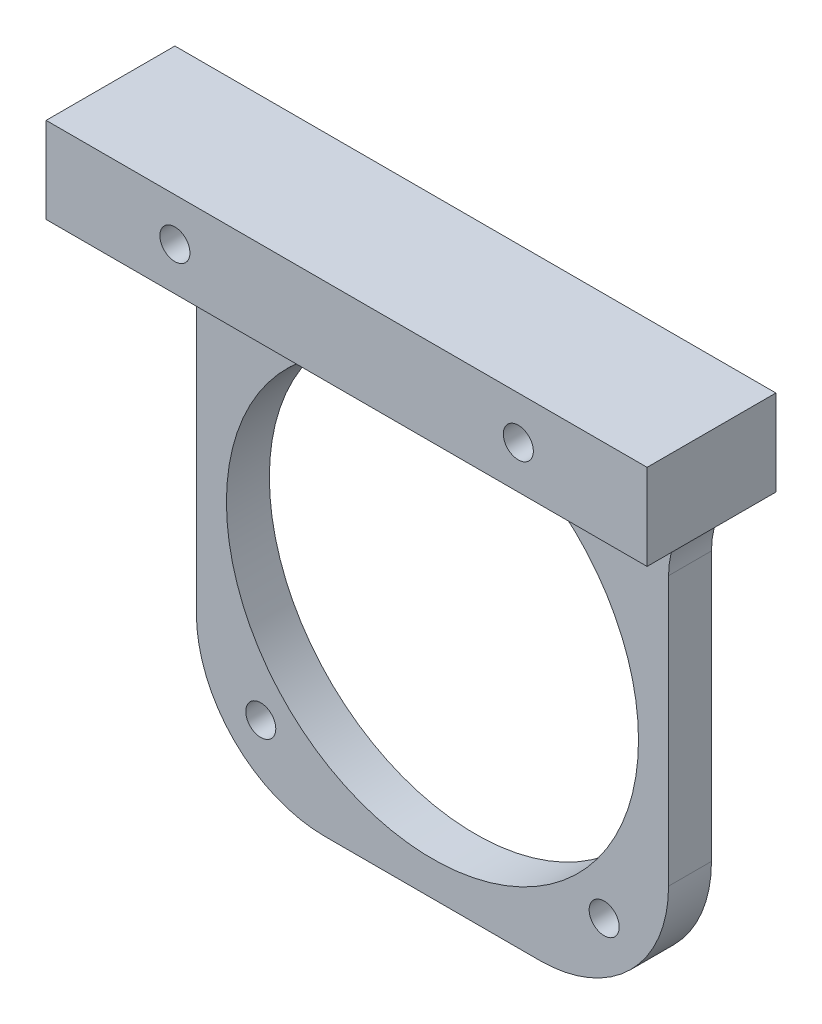
ISO-10303-21;
HEADER;
FILE_DESCRIPTION(('STEP AP214'),'2;1');
FILE_NAME('part.step','',(''),(''),'','','');
FILE_SCHEMA(('AUTOMOTIVE_DESIGN { 1 0 10303 214 1 1 1 1 }'));
ENDSEC;
DATA;
#1=APPLICATION_CONTEXT('core data for automotive mechanical design processes');
#2=APPLICATION_PROTOCOL_DEFINITION('international standard','automotive_design',2000,#1);
#3=PRODUCT_CONTEXT('',#1,'mechanical');
#4=PRODUCT('Part','Part','',(#3));
#5=PRODUCT_RELATED_PRODUCT_CATEGORY('part','',(#4));
#6=PRODUCT_DEFINITION_FORMATION('','',#4);
#7=PRODUCT_DEFINITION_CONTEXT('part definition',#1,'design');
#8=PRODUCT_DEFINITION('design','',#6,#7);
#9=PRODUCT_DEFINITION_SHAPE('','',#8);
#10=(LENGTH_UNIT() NAMED_UNIT(*) SI_UNIT(.MILLI.,.METRE.));
#11=(NAMED_UNIT(*) PLANE_ANGLE_UNIT() SI_UNIT($,.RADIAN.));
#12=(NAMED_UNIT(*) SI_UNIT($,.STERADIAN.) SOLID_ANGLE_UNIT());
#13=UNCERTAINTY_MEASURE_WITH_UNIT(LENGTH_MEASURE(1.E-05),#10,'distance_accuracy_value','');
#14=(GEOMETRIC_REPRESENTATION_CONTEXT(3) GLOBAL_UNCERTAINTY_ASSIGNED_CONTEXT((#13)) GLOBAL_UNIT_ASSIGNED_CONTEXT((#10,
#11,#12)) REPRESENTATION_CONTEXT('',''));
#15=CARTESIAN_POINT('',(0.,0.,0.));
#16=DIRECTION('',(0.,0.,1.));
#17=DIRECTION('',(1.,0.,0.));
#18=AXIS2_PLACEMENT_3D('',#15,#16,#17);
#19=CARTESIAN_POINT('',(-20.,33.,-11.));
#20=DIRECTION('',(0.,0.,1.));
#21=DIRECTION('',(1.,0.,0.));
#22=AXIS2_PLACEMENT_3D('',#19,#20,#21);
#23=CYLINDRICAL_SURFACE('',#22,1.75);
#24=CARTESIAN_POINT('',(-20.,33.,15.));
#25=DIRECTION('',(0.,0.,1.));
#26=DIRECTION('',(1.,0.,0.));
#27=AXIS2_PLACEMENT_3D('',#24,#25,#26);
#28=CIRCLE('',#27,1.75);
#29=CARTESIAN_POINT('',(-18.25,33.,15.));
#30=VERTEX_POINT('',#29);
#31=EDGE_CURVE('E301',#30,#30,#28,.T.);
#32=ORIENTED_EDGE('',*,*,#31,.T.);
#33=EDGE_LOOP('',(#32));
#34=FACE_BOUND('',#33,.T.);
#35=CARTESIAN_POINT('',(-20.,33.,2.));
#36=DIRECTION('',(0.,0.,-1.));
#37=DIRECTION('',(-1.,0.,0.));
#38=AXIS2_PLACEMENT_3D('',#35,#36,#37);
#39=CIRCLE('',#38,1.75);
#40=CARTESIAN_POINT('',(-21.75,33.,2.));
#41=VERTEX_POINT('',#40);
#42=EDGE_CURVE('E241',#41,#41,#39,.F.);
#43=ORIENTED_EDGE('',*,*,#42,.F.);
#44=EDGE_LOOP('',(#43));
#45=FACE_BOUND('',#44,.T.);
#46=ADVANCED_FACE('F35',(#34,#45),#23,.F.);
#47=CARTESIAN_POINT('',(20.,33.,-11.));
#48=DIRECTION('',(0.,0.,1.));
#49=DIRECTION('',(1.,0.,0.));
#50=AXIS2_PLACEMENT_3D('',#47,#48,#49);
#51=CYLINDRICAL_SURFACE('',#50,1.75);
#52=CARTESIAN_POINT('',(20.,33.,15.));
#53=DIRECTION('',(0.,0.,1.));
#54=DIRECTION('',(1.,0.,0.));
#55=AXIS2_PLACEMENT_3D('',#52,#53,#54);
#56=CIRCLE('',#55,1.75);
#57=CARTESIAN_POINT('',(21.75,33.,15.));
#58=VERTEX_POINT('',#57);
#59=EDGE_CURVE('E298',#58,#58,#56,.T.);
#60=ORIENTED_EDGE('',*,*,#59,.T.);
#61=EDGE_LOOP('',(#60));
#62=FACE_BOUND('',#61,.T.);
#63=CARTESIAN_POINT('',(20.,33.,2.));
#64=DIRECTION('',(0.,0.,-1.));
#65=DIRECTION('',(-1.,0.,0.));
#66=AXIS2_PLACEMENT_3D('',#63,#64,#65);
#67=CIRCLE('',#66,1.75);
#68=CARTESIAN_POINT('',(18.25,33.,2.));
#69=VERTEX_POINT('',#68);
#70=EDGE_CURVE('E287',#69,#69,#67,.F.);
#71=ORIENTED_EDGE('',*,*,#70,.F.);
#72=EDGE_LOOP('',(#71));
#73=FACE_BOUND('',#72,.T.);
#74=ADVANCED_FACE('F474',(#62,#73),#51,.F.);
#75=CARTESIAN_POINT('',(27.5,0.,5.));
#76=DIRECTION('',(1.,0.,0.));
#77=DIRECTION('',(0.,0.,-1.));
#78=AXIS2_PLACEMENT_3D('',#75,#76,#77);
#79=PLANE('',#78);
#80=DIRECTION('',(0.,-1.,0.));
#81=VECTOR('',#80,1.);
#82=CARTESIAN_POINT('',(27.5,0.,0.));
#83=LINE('',#82,#81);
#84=CARTESIAN_POINT('',(27.5,18.3175416344815,0.));
#85=VERTEX_POINT('',#84);
#86=CARTESIAN_POINT('',(27.5,-13.,0.));
#87=VERTEX_POINT('',#86);
#88=EDGE_CURVE('E359',#85,#87,#83,.T.);
#89=ORIENTED_EDGE('',*,*,#88,.F.);
#90=DIRECTION('',(0.,0.,1.));
#91=VECTOR('',#90,1.);
#92=CARTESIAN_POINT('',(27.5,18.3175416344815,5.));
#93=LINE('',#92,#91);
#94=CARTESIAN_POINT('',(27.5,18.3175416344815,5.));
#95=VERTEX_POINT('',#94);
#96=EDGE_CURVE('E56',#85,#95,#93,.T.);
#97=ORIENTED_EDGE('',*,*,#96,.T.);
#98=DIRECTION('',(0.,-1.,0.));
#99=VECTOR('',#98,1.);
#100=CARTESIAN_POINT('',(27.5,0.,5.));
#101=LINE('',#100,#99);
#102=CARTESIAN_POINT('',(27.5,-13.,5.));
#103=VERTEX_POINT('',#102);
#104=EDGE_CURVE('E337',#95,#103,#101,.T.);
#105=ORIENTED_EDGE('',*,*,#104,.T.);
#106=DIRECTION('',(0.,0.,-1.));
#107=VECTOR('',#106,1.);
#108=CARTESIAN_POINT('',(27.5,-13.,0.));
#109=LINE('',#108,#107);
#110=EDGE_CURVE('E320',#103,#87,#109,.T.);
#111=ORIENTED_EDGE('',*,*,#110,.T.);
#112=EDGE_LOOP('',(#89,#97,#105,#111));
#113=FACE_BOUND('',#112,.T.);
#114=ADVANCED_FACE('F452',(#113),#79,.T.);
#115=CARTESIAN_POINT('',(35.,0.,5.));
#116=DIRECTION('',(1.,0.,0.));
#117=DIRECTION('',(0.,0.,-1.));
#118=AXIS2_PLACEMENT_3D('',#115,#116,#117);
#119=PLANE('',#118);
#120=DIRECTION('',(0.,-1.,0.));
#121=VECTOR('',#120,1.);
#122=CARTESIAN_POINT('',(35.,0.,0.));
#123=LINE('',#122,#121);
#124=CARTESIAN_POINT('',(35.,38.,0.));
#125=VERTEX_POINT('',#124);
#126=CARTESIAN_POINT('',(35.,28.,0.));
#127=VERTEX_POINT('',#126);
#128=EDGE_CURVE('E361',#125,#127,#123,.T.);
#129=ORIENTED_EDGE('',*,*,#128,.F.);
#130=DIRECTION('',(0.,0.,-1.));
#131=VECTOR('',#130,1.);
#132=CARTESIAN_POINT('',(35.,38.,5.));
#133=LINE('',#132,#131);
#134=CARTESIAN_POINT('',(35.,38.,15.));
#135=VERTEX_POINT('',#134);
#136=EDGE_CURVE('E378',#135,#125,#133,.T.);
#137=ORIENTED_EDGE('',*,*,#136,.F.);
#138=DIRECTION('',(0.,1.,0.));
#139=VECTOR('',#138,1.);
#140=CARTESIAN_POINT('',(35.,38.,15.));
#141=LINE('',#140,#139);
#142=CARTESIAN_POINT('',(35.,28.,15.));
#143=VERTEX_POINT('',#142);
#144=EDGE_CURVE('E310',#143,#135,#141,.T.);
#145=ORIENTED_EDGE('',*,*,#144,.F.);
#146=DIRECTION('',(0.,0.,-1.));
#147=VECTOR('',#146,1.);
#148=CARTESIAN_POINT('',(35.,28.,5.));
#149=LINE('',#148,#147);
#150=CARTESIAN_POINT('',(35.,28.,5.));
#151=VERTEX_POINT('',#150);
#152=EDGE_CURVE('E381',#143,#151,#149,.T.);
#153=ORIENTED_EDGE('',*,*,#152,.T.);
#154=EDGE_CURVE('E380',#151,#127,#149,.T.);
#155=ORIENTED_EDGE('',*,*,#154,.T.);
#156=EDGE_LOOP('',(#129,#137,#145,#153,#155));
#157=FACE_BOUND('',#156,.T.);
#158=ADVANCED_FACE('F445',(#157),#119,.T.);
#159=CARTESIAN_POINT('',(0.,38.,5.));
#160=DIRECTION('',(0.,1.,0.));
#161=DIRECTION('',(0.,0.,1.));
#162=AXIS2_PLACEMENT_3D('',#159,#160,#161);
#163=PLANE('',#162);
#164=DIRECTION('',(1.,0.,0.));
#165=VECTOR('',#164,1.);
#166=CARTESIAN_POINT('',(0.,38.,0.));
#167=LINE('',#166,#165);
#168=CARTESIAN_POINT('',(-35.,38.,0.));
#169=VERTEX_POINT('',#168);
#170=EDGE_CURVE('E363',#169,#125,#167,.T.);
#171=ORIENTED_EDGE('',*,*,#170,.F.);
#172=DIRECTION('',(0.,0.,-1.));
#173=VECTOR('',#172,1.);
#174=CARTESIAN_POINT('',(-35.,38.,5.));
#175=LINE('',#174,#173);
#176=CARTESIAN_POINT('',(-35.,38.,15.));
#177=VERTEX_POINT('',#176);
#178=EDGE_CURVE('E376',#177,#169,#175,.T.);
#179=ORIENTED_EDGE('',*,*,#178,.F.);
#180=DIRECTION('',(-1.,0.,0.));
#181=VECTOR('',#180,1.);
#182=CARTESIAN_POINT('',(-35.,38.,15.));
#183=LINE('',#182,#181);
#184=EDGE_CURVE('E313',#135,#177,#183,.T.);
#185=ORIENTED_EDGE('',*,*,#184,.F.);
#186=ORIENTED_EDGE('',*,*,#136,.T.);
#187=EDGE_LOOP('',(#171,#179,#185,#186));
#188=FACE_BOUND('',#187,.T.);
#189=ADVANCED_FACE('F438',(#188),#163,.T.);
#190=CARTESIAN_POINT('',(-35.,0.,5.));
#191=DIRECTION('',(1.,0.,0.));
#192=DIRECTION('',(0.,0.,-1.));
#193=AXIS2_PLACEMENT_3D('',#190,#191,#192);
#194=PLANE('',#193);
#195=DIRECTION('',(0.,-1.,0.));
#196=VECTOR('',#195,1.);
#197=CARTESIAN_POINT('',(-35.,0.,0.));
#198=LINE('',#197,#196);
#199=CARTESIAN_POINT('',(-35.,28.,0.));
#200=VERTEX_POINT('',#199);
#201=EDGE_CURVE('E366',#169,#200,#198,.T.);
#202=ORIENTED_EDGE('',*,*,#201,.T.);
#203=DIRECTION('',(0.,0.,-1.));
#204=VECTOR('',#203,1.);
#205=CARTESIAN_POINT('',(-35.,28.,5.));
#206=LINE('',#205,#204);
#207=CARTESIAN_POINT('',(-35.,28.,5.));
#208=VERTEX_POINT('',#207);
#209=EDGE_CURVE('E344',#208,#200,#206,.T.);
#210=ORIENTED_EDGE('',*,*,#209,.F.);
#211=CARTESIAN_POINT('',(-35.,28.,15.));
#212=VERTEX_POINT('',#211);
#213=EDGE_CURVE('E373',#212,#208,#206,.T.);
#214=ORIENTED_EDGE('',*,*,#213,.F.);
#215=DIRECTION('',(0.,-1.,0.));
#216=VECTOR('',#215,1.);
#217=CARTESIAN_POINT('',(-35.,38.,15.));
#218=LINE('',#217,#216);
#219=EDGE_CURVE('E304',#177,#212,#218,.T.);
#220=ORIENTED_EDGE('',*,*,#219,.F.);
#221=ORIENTED_EDGE('',*,*,#178,.T.);
#222=EDGE_LOOP('',(#202,#210,#214,#220,#221));
#223=FACE_BOUND('',#222,.T.);
#224=ADVANCED_FACE('F434',(#223),#194,.F.);
#225=CARTESIAN_POINT('',(0.,28.,5.));
#226=DIRECTION('',(0.,1.,0.));
#227=DIRECTION('',(0.,0.,1.));
#228=AXIS2_PLACEMENT_3D('',#225,#226,#227);
#229=PLANE('',#228);
#230=ORIENTED_EDGE('',*,*,#213,.T.);
#231=DIRECTION('',(1.,0.,0.));
#232=VECTOR('',#231,1.);
#233=CARTESIAN_POINT('',(-35.,28.,5.));
#234=LINE('',#233,#232);
#235=EDGE_CURVE('E317',#208,#151,#234,.T.);
#236=ORIENTED_EDGE('',*,*,#235,.T.);
#237=ORIENTED_EDGE('',*,*,#152,.F.);
#238=DIRECTION('',(1.,0.,0.));
#239=VECTOR('',#238,1.);
#240=CARTESIAN_POINT('',(-35.,28.,15.));
#241=LINE('',#240,#239);
#242=EDGE_CURVE('E307',#212,#143,#241,.T.);
#243=ORIENTED_EDGE('',*,*,#242,.F.);
#244=EDGE_LOOP('',(#230,#236,#237,#243));
#245=FACE_BOUND('',#244,.T.);
#246=ADVANCED_FACE('F497',(#245),#229,.F.);
#247=CARTESIAN_POINT('',(-27.5,0.,5.));
#248=DIRECTION('',(1.,0.,0.));
#249=DIRECTION('',(0.,0.,-1.));
#250=AXIS2_PLACEMENT_3D('',#247,#248,#249);
#251=PLANE('',#250);
#252=DIRECTION('',(0.,-1.,0.));
#253=VECTOR('',#252,1.);
#254=CARTESIAN_POINT('',(-27.5,0.,5.));
#255=LINE('',#254,#253);
#256=CARTESIAN_POINT('',(-27.5,18.3175416344815,5.));
#257=VERTEX_POINT('',#256);
#258=CARTESIAN_POINT('',(-27.5,-13.,5.));
#259=VERTEX_POINT('',#258);
#260=EDGE_CURVE('E339',#257,#259,#255,.T.);
#261=ORIENTED_EDGE('',*,*,#260,.F.);
#262=DIRECTION('',(0.,0.,-1.));
#263=VECTOR('',#262,1.);
#264=CARTESIAN_POINT('',(-27.5,18.3175416344815,5.));
#265=LINE('',#264,#263);
#266=CARTESIAN_POINT('',(-27.5,18.3175416344815,0.));
#267=VERTEX_POINT('',#266);
#268=EDGE_CURVE('E319',#257,#267,#265,.T.);
#269=ORIENTED_EDGE('',*,*,#268,.T.);
#270=DIRECTION('',(0.,-1.,0.));
#271=VECTOR('',#270,1.);
#272=CARTESIAN_POINT('',(-27.5,0.,0.));
#273=LINE('',#272,#271);
#274=CARTESIAN_POINT('',(-27.5,-13.,0.));
#275=VERTEX_POINT('',#274);
#276=EDGE_CURVE('E369',#267,#275,#273,.T.);
#277=ORIENTED_EDGE('',*,*,#276,.T.);
#278=DIRECTION('',(0.,0.,-1.));
#279=VECTOR('',#278,1.);
#280=CARTESIAN_POINT('',(-27.5,-13.,5.));
#281=LINE('',#280,#279);
#282=EDGE_CURVE('E394',#275,#259,#281,.F.);
#283=ORIENTED_EDGE('',*,*,#282,.T.);
#284=EDGE_LOOP('',(#261,#269,#277,#283));
#285=FACE_BOUND('',#284,.T.);
#286=ADVANCED_FACE('F424',(#285),#251,.F.);
#287=CARTESIAN_POINT('',(0.,0.,5.));
#288=DIRECTION('',(0.,0.,-1.));
#289=DIRECTION('',(-1.,0.,0.));
#290=AXIS2_PLACEMENT_3D('',#287,#288,#289);
#291=CYLINDRICAL_SURFACE('',#290,24.);
#292=CARTESIAN_POINT('',(0.,0.,5.));
#293=DIRECTION('',(0.,0.,1.));
#294=DIRECTION('',(1.,0.,0.));
#295=AXIS2_PLACEMENT_3D('',#292,#293,#294);
#296=CIRCLE('',#295,24.);
#297=CARTESIAN_POINT('',(24.,0.,5.));
#298=VERTEX_POINT('',#297);
#299=EDGE_CURVE('E334',#298,#298,#296,.T.);
#300=ORIENTED_EDGE('',*,*,#299,.T.);
#301=EDGE_LOOP('',(#300));
#302=FACE_BOUND('',#301,.T.);
#303=CARTESIAN_POINT('',(0.,0.,0.));
#304=DIRECTION('',(0.,0.,1.));
#305=DIRECTION('',(1.,0.,0.));
#306=AXIS2_PLACEMENT_3D('',#303,#304,#305);
#307=CIRCLE('',#306,24.);
#308=CARTESIAN_POINT('',(24.,0.,0.));
#309=VERTEX_POINT('',#308);
#310=EDGE_CURVE('E356',#309,#309,#307,.T.);
#311=ORIENTED_EDGE('',*,*,#310,.F.);
#312=EDGE_LOOP('',(#311));
#313=FACE_BOUND('',#312,.T.);
#314=ADVANCED_FACE('F496',(#302,#313),#291,.F.);
#315=CARTESIAN_POINT('',(-20.0000000000001,20.,5.));
#316=DIRECTION('',(0.,0.,-1.));
#317=DIRECTION('',(-1.,0.,0.));
#318=AXIS2_PLACEMENT_3D('',#315,#316,#317);
#319=CYLINDRICAL_SURFACE('',#318,1.75);
#320=CARTESIAN_POINT('',(-20.0000000000001,20.,5.));
#321=DIRECTION('',(0.,0.,1.));
#322=DIRECTION('',(1.,0.,0.));
#323=AXIS2_PLACEMENT_3D('',#320,#321,#322);
#324=CIRCLE('',#323,1.75);
#325=CARTESIAN_POINT('',(-18.2500000000001,20.,5.));
#326=VERTEX_POINT('',#325);
#327=EDGE_CURVE('E331',#326,#326,#324,.T.);
#328=ORIENTED_EDGE('',*,*,#327,.T.);
#329=EDGE_LOOP('',(#328));
#330=FACE_BOUND('',#329,.T.);
#331=CARTESIAN_POINT('',(-20.0000000000001,20.,0.));
#332=DIRECTION('',(0.,0.,1.));
#333=DIRECTION('',(1.,0.,0.));
#334=AXIS2_PLACEMENT_3D('',#331,#332,#333);
#335=CIRCLE('',#334,1.75);
#336=CARTESIAN_POINT('',(-18.2500000000001,20.,0.));
#337=VERTEX_POINT('',#336);
#338=EDGE_CURVE('E353',#337,#337,#335,.T.);
#339=ORIENTED_EDGE('',*,*,#338,.F.);
#340=EDGE_LOOP('',(#339));
#341=FACE_BOUND('',#340,.T.);
#342=ADVANCED_FACE('F511',(#330,#341),#319,.F.);
#343=CARTESIAN_POINT('',(19.9999999999999,20.,5.));
#344=DIRECTION('',(0.,0.,-1.));
#345=DIRECTION('',(-1.,0.,0.));
#346=AXIS2_PLACEMENT_3D('',#343,#344,#345);
#347=CYLINDRICAL_SURFACE('',#346,1.75);
#348=CARTESIAN_POINT('',(19.9999999999999,20.,5.));
#349=DIRECTION('',(0.,0.,1.));
#350=DIRECTION('',(1.,0.,0.));
#351=AXIS2_PLACEMENT_3D('',#348,#349,#350);
#352=CIRCLE('',#351,1.75);
#353=CARTESIAN_POINT('',(21.7499999999999,20.,5.));
#354=VERTEX_POINT('',#353);
#355=EDGE_CURVE('E328',#354,#354,#352,.T.);
#356=ORIENTED_EDGE('',*,*,#355,.T.);
#357=EDGE_LOOP('',(#356));
#358=FACE_BOUND('',#357,.T.);
#359=CARTESIAN_POINT('',(19.9999999999999,20.,0.));
#360=DIRECTION('',(0.,0.,1.));
#361=DIRECTION('',(1.,0.,0.));
#362=AXIS2_PLACEMENT_3D('',#359,#360,#361);
#363=CIRCLE('',#362,1.75);
#364=CARTESIAN_POINT('',(21.7499999999999,20.,0.));
#365=VERTEX_POINT('',#364);
#366=EDGE_CURVE('E350',#365,#365,#363,.T.);
#367=ORIENTED_EDGE('',*,*,#366,.F.);
#368=EDGE_LOOP('',(#367));
#369=FACE_BOUND('',#368,.T.);
#370=ADVANCED_FACE('F515',(#358,#369),#347,.F.);
#371=CARTESIAN_POINT('',(20.0000000000001,-20.,5.));
#372=DIRECTION('',(0.,0.,-1.));
#373=DIRECTION('',(-1.,0.,0.));
#374=AXIS2_PLACEMENT_3D('',#371,#372,#373);
#375=CYLINDRICAL_SURFACE('',#374,1.75);
#376=CARTESIAN_POINT('',(20.0000000000001,-20.,5.));
#377=DIRECTION('',(0.,0.,1.));
#378=DIRECTION('',(1.,0.,0.));
#379=AXIS2_PLACEMENT_3D('',#376,#377,#378);
#380=CIRCLE('',#379,1.75);
#381=CARTESIAN_POINT('',(21.7500000000001,-20.,5.));
#382=VERTEX_POINT('',#381);
#383=EDGE_CURVE('E324',#382,#382,#380,.T.);
#384=ORIENTED_EDGE('',*,*,#383,.T.);
#385=EDGE_LOOP('',(#384));
#386=FACE_BOUND('',#385,.T.);
#387=CARTESIAN_POINT('',(20.0000000000001,-20.,0.));
#388=DIRECTION('',(0.,0.,1.));
#389=DIRECTION('',(1.,0.,0.));
#390=AXIS2_PLACEMENT_3D('',#387,#388,#389);
#391=CIRCLE('',#390,1.75);
#392=CARTESIAN_POINT('',(21.7500000000001,-20.,0.));
#393=VERTEX_POINT('',#392);
#394=EDGE_CURVE('E347',#393,#393,#391,.T.);
#395=ORIENTED_EDGE('',*,*,#394,.F.);
#396=EDGE_LOOP('',(#395));
#397=FACE_BOUND('',#396,.T.);
#398=ADVANCED_FACE('F519',(#386,#397),#375,.F.);
#399=CARTESIAN_POINT('',(-19.9999999999999,-20.,5.));
#400=DIRECTION('',(0.,0.,-1.));
#401=DIRECTION('',(-1.,0.,0.));
#402=AXIS2_PLACEMENT_3D('',#399,#400,#401);
#403=CYLINDRICAL_SURFACE('',#402,1.75);
#404=CARTESIAN_POINT('',(-19.9999999999999,-20.,5.));
#405=DIRECTION('',(0.,0.,1.));
#406=DIRECTION('',(1.,0.,0.));
#407=AXIS2_PLACEMENT_3D('',#404,#405,#406);
#408=CIRCLE('',#407,1.75);
#409=CARTESIAN_POINT('',(-18.2499999999999,-20.,5.));
#410=VERTEX_POINT('',#409);
#411=EDGE_CURVE('E321',#410,#410,#408,.T.);
#412=ORIENTED_EDGE('',*,*,#411,.T.);
#413=EDGE_LOOP('',(#412));
#414=FACE_BOUND('',#413,.T.);
#415=CARTESIAN_POINT('',(-19.9999999999999,-20.,0.));
#416=DIRECTION('',(0.,0.,1.));
#417=DIRECTION('',(1.,0.,0.));
#418=AXIS2_PLACEMENT_3D('',#415,#416,#417);
#419=CIRCLE('',#418,1.75);
#420=CARTESIAN_POINT('',(-18.2499999999999,-20.,0.));
#421=VERTEX_POINT('',#420);
#422=EDGE_CURVE('E316',#421,#421,#419,.T.);
#423=ORIENTED_EDGE('',*,*,#422,.F.);
#424=EDGE_LOOP('',(#423));
#425=FACE_BOUND('',#424,.T.);
#426=ADVANCED_FACE('F493',(#414,#425),#403,.F.);
#427=CARTESIAN_POINT('',(0.,-28.,5.));
#428=DIRECTION('',(0.,1.,0.));
#429=DIRECTION('',(0.,0.,1.));
#430=AXIS2_PLACEMENT_3D('',#427,#428,#429);
#431=PLANE('',#430);
#432=DIRECTION('',(1.,0.,0.));
#433=VECTOR('',#432,1.);
#434=CARTESIAN_POINT('',(0.,-28.,5.));
#435=LINE('',#434,#433);
#436=CARTESIAN_POINT('',(-12.5,-28.,5.));
#437=VERTEX_POINT('',#436);
#438=CARTESIAN_POINT('',(12.5,-28.,5.));
#439=VERTEX_POINT('',#438);
#440=EDGE_CURVE('E341',#437,#439,#435,.T.);
#441=ORIENTED_EDGE('',*,*,#440,.F.);
#442=DIRECTION('',(0.,0.,-1.));
#443=VECTOR('',#442,1.);
#444=CARTESIAN_POINT('',(-12.5,-28.,5.));
#445=LINE('',#444,#443);
#446=CARTESIAN_POINT('',(-12.5,-28.,0.));
#447=VERTEX_POINT('',#446);
#448=EDGE_CURVE('E386',#437,#447,#445,.T.);
#449=ORIENTED_EDGE('',*,*,#448,.T.);
#450=DIRECTION('',(1.,0.,0.));
#451=VECTOR('',#450,1.);
#452=CARTESIAN_POINT('',(0.,-28.,0.));
#453=LINE('',#452,#451);
#454=CARTESIAN_POINT('',(12.5,-28.,0.));
#455=VERTEX_POINT('',#454);
#456=EDGE_CURVE('E325',#447,#455,#453,.T.);
#457=ORIENTED_EDGE('',*,*,#456,.T.);
#458=DIRECTION('',(0.,0.,-1.));
#459=VECTOR('',#458,1.);
#460=CARTESIAN_POINT('',(12.5,-28.,5.));
#461=LINE('',#460,#459);
#462=EDGE_CURVE('E384',#455,#439,#461,.F.);
#463=ORIENTED_EDGE('',*,*,#462,.T.);
#464=EDGE_LOOP('',(#441,#449,#457,#463));
#465=FACE_BOUND('',#464,.T.);
#466=ADVANCED_FACE('F459',(#465),#431,.F.);
#467=CARTESIAN_POINT('',(0.,0.,5.));
#468=DIRECTION('',(0.,0.,1.));
#469=DIRECTION('',(1.,0.,0.));
#470=AXIS2_PLACEMENT_3D('',#467,#468,#469);
#471=PLANE('',#470);
#472=ORIENTED_EDGE('',*,*,#235,.F.);
#473=CARTESIAN_POINT('',(-37.5,18.3175416344815,5.));
#474=DIRECTION('',(0.,0.,1.));
#475=DIRECTION('',(1.,0.,0.));
#476=AXIS2_PLACEMENT_3D('',#473,#474,#475);
#477=CIRCLE('',#476,10.);
#478=EDGE_CURVE('E413',#208,#257,#477,.F.);
#479=ORIENTED_EDGE('',*,*,#478,.T.);
#480=ORIENTED_EDGE('',*,*,#260,.T.);
#481=CARTESIAN_POINT('',(-12.5,-13.,5.));
#482=DIRECTION('',(0.,0.,1.));
#483=DIRECTION('',(1.,0.,0.));
#484=AXIS2_PLACEMENT_3D('',#481,#482,#483);
#485=CIRCLE('',#484,15.);
#486=EDGE_CURVE('E400',#259,#437,#485,.T.);
#487=ORIENTED_EDGE('',*,*,#486,.T.);
#488=ORIENTED_EDGE('',*,*,#440,.T.);
#489=CARTESIAN_POINT('',(12.5,-13.,5.));
#490=DIRECTION('',(0.,0.,1.));
#491=DIRECTION('',(1.,0.,0.));
#492=AXIS2_PLACEMENT_3D('',#489,#490,#491);
#493=CIRCLE('',#492,15.);
#494=EDGE_CURVE('E397',#439,#103,#493,.T.);
#495=ORIENTED_EDGE('',*,*,#494,.T.);
#496=ORIENTED_EDGE('',*,*,#104,.F.);
#497=CARTESIAN_POINT('',(37.5,18.3175416344815,5.));
#498=DIRECTION('',(0.,0.,1.));
#499=DIRECTION('',(1.,0.,0.));
#500=AXIS2_PLACEMENT_3D('',#497,#498,#499);
#501=CIRCLE('',#500,10.);
#502=EDGE_CURVE('E11',#95,#151,#501,.F.);
#503=ORIENTED_EDGE('',*,*,#502,.T.);
#504=EDGE_LOOP('',(#472,#479,#480,#487,#488,#495,#496,#503));
#505=FACE_BOUND('',#504,.T.);
#506=ORIENTED_EDGE('',*,*,#411,.F.);
#507=EDGE_LOOP('',(#506));
#508=FACE_BOUND('',#507,.T.);
#509=ORIENTED_EDGE('',*,*,#383,.F.);
#510=EDGE_LOOP('',(#509));
#511=FACE_BOUND('',#510,.T.);
#512=ORIENTED_EDGE('',*,*,#355,.F.);
#513=EDGE_LOOP('',(#512));
#514=FACE_BOUND('',#513,.T.);
#515=ORIENTED_EDGE('',*,*,#327,.F.);
#516=EDGE_LOOP('',(#515));
#517=FACE_BOUND('',#516,.T.);
#518=ORIENTED_EDGE('',*,*,#299,.F.);
#519=EDGE_LOOP('',(#518));
#520=FACE_BOUND('',#519,.T.);
#521=ADVANCED_FACE('F417',(#505,#508,#511,#514,#517,#520),#471,.T.);
#522=CARTESIAN_POINT('',(0.,0.,0.));
#523=DIRECTION('',(0.,0.,1.));
#524=DIRECTION('',(1.,0.,0.));
#525=AXIS2_PLACEMENT_3D('',#522,#523,#524);
#526=PLANE('',#525);
#527=DIRECTION('',(-0.5,-0.866025403784438,0.));
#528=VECTOR('',#527,1.);
#529=CARTESIAN_POINT('',(-16.7091034656191,33.,0.));
#530=LINE('',#529,#528);
#531=CARTESIAN_POINT('',(-16.7091034656191,33.,0.));
#532=VERTEX_POINT('',#531);
#533=CARTESIAN_POINT('',(-18.3545517328096,30.15,0.));
#534=VERTEX_POINT('',#533);
#535=EDGE_CURVE('E229',#532,#534,#530,.T.);
#536=ORIENTED_EDGE('',*,*,#535,.F.);
#537=DIRECTION('',(0.5,-0.866025403784438,0.));
#538=VECTOR('',#537,1.);
#539=CARTESIAN_POINT('',(-18.3545517328096,35.85,0.));
#540=LINE('',#539,#538);
#541=CARTESIAN_POINT('',(-18.3545517328096,35.85,0.));
#542=VERTEX_POINT('',#541);
#543=EDGE_CURVE('E196',#542,#532,#540,.T.);
#544=ORIENTED_EDGE('',*,*,#543,.F.);
#545=DIRECTION('',(1.,0.,0.));
#546=VECTOR('',#545,1.);
#547=CARTESIAN_POINT('',(-21.6454482671904,35.85,0.));
#548=LINE('',#547,#546);
#549=CARTESIAN_POINT('',(-21.6454482671904,35.85,0.));
#550=VERTEX_POINT('',#549);
#551=EDGE_CURVE('E215',#550,#542,#548,.T.);
#552=ORIENTED_EDGE('',*,*,#551,.F.);
#553=DIRECTION('',(0.5,0.866025403784438,0.));
#554=VECTOR('',#553,1.);
#555=CARTESIAN_POINT('',(-23.2908965343809,33.,0.));
#556=LINE('',#555,#554);
#557=CARTESIAN_POINT('',(-23.2908965343809,33.,0.));
#558=VERTEX_POINT('',#557);
#559=EDGE_CURVE('E218',#558,#550,#556,.T.);
#560=ORIENTED_EDGE('',*,*,#559,.F.);
#561=DIRECTION('',(-0.499999999999999,0.866025403784439,0.));
#562=VECTOR('',#561,1.);
#563=CARTESIAN_POINT('',(-21.6454482671904,30.15,0.));
#564=LINE('',#563,#562);
#565=CARTESIAN_POINT('',(-21.6454482671904,30.15,0.));
#566=VERTEX_POINT('',#565);
#567=EDGE_CURVE('E234',#566,#558,#564,.T.);
#568=ORIENTED_EDGE('',*,*,#567,.F.);
#569=DIRECTION('',(-1.,0.,0.));
#570=VECTOR('',#569,1.);
#571=CARTESIAN_POINT('',(-18.3545517328096,30.15,0.));
#572=LINE('',#571,#570);
#573=EDGE_CURVE('E231',#534,#566,#572,.T.);
#574=ORIENTED_EDGE('',*,*,#573,.F.);
#575=EDGE_LOOP('',(#536,#544,#552,#560,#568,#574));
#576=FACE_BOUND('',#575,.T.);
#577=DIRECTION('',(0.500000000000001,0.866025403784438,0.));
#578=VECTOR('',#577,1.);
#579=CARTESIAN_POINT('',(16.7091034656191,33.,0.));
#580=LINE('',#579,#578);
#581=CARTESIAN_POINT('',(16.7091034656191,33.,0.));
#582=VERTEX_POINT('',#581);
#583=CARTESIAN_POINT('',(18.3545517328096,35.85,0.));
#584=VERTEX_POINT('',#583);
#585=EDGE_CURVE('E271',#582,#584,#580,.T.);
#586=ORIENTED_EDGE('',*,*,#585,.F.);
#587=DIRECTION('',(-0.499999999999998,0.86602540378444,0.));
#588=VECTOR('',#587,1.);
#589=CARTESIAN_POINT('',(18.3545517328096,30.15,0.));
#590=LINE('',#589,#588);
#591=CARTESIAN_POINT('',(18.3545517328096,30.15,0.));
#592=VERTEX_POINT('',#591);
#593=EDGE_CURVE('E269',#592,#582,#590,.T.);
#594=ORIENTED_EDGE('',*,*,#593,.F.);
#595=DIRECTION('',(-1.,0.,0.));
#596=VECTOR('',#595,1.);
#597=CARTESIAN_POINT('',(21.6454482671904,30.15,0.));
#598=LINE('',#597,#596);
#599=CARTESIAN_POINT('',(21.6454482671904,30.15,0.));
#600=VERTEX_POINT('',#599);
#601=EDGE_CURVE('E253',#600,#592,#598,.T.);
#602=ORIENTED_EDGE('',*,*,#601,.F.);
#603=DIRECTION('',(-0.5,-0.866025403784439,0.));
#604=VECTOR('',#603,1.);
#605=CARTESIAN_POINT('',(23.2908965343809,33.,0.));
#606=LINE('',#605,#604);
#607=CARTESIAN_POINT('',(23.2908965343809,33.,0.));
#608=VERTEX_POINT('',#607);
#609=EDGE_CURVE('E280',#608,#600,#606,.T.);
#610=ORIENTED_EDGE('',*,*,#609,.F.);
#611=DIRECTION('',(0.5,-0.866025403784438,0.));
#612=VECTOR('',#611,1.);
#613=CARTESIAN_POINT('',(21.6454482671904,35.85,0.));
#614=LINE('',#613,#612);
#615=CARTESIAN_POINT('',(21.6454482671904,35.85,0.));
#616=VERTEX_POINT('',#615);
#617=EDGE_CURVE('E277',#616,#608,#614,.T.);
#618=ORIENTED_EDGE('',*,*,#617,.F.);
#619=DIRECTION('',(1.,0.,0.));
#620=VECTOR('',#619,1.);
#621=CARTESIAN_POINT('',(18.3545517328096,35.85,0.));
#622=LINE('',#621,#620);
#623=EDGE_CURVE('E274',#584,#616,#622,.T.);
#624=ORIENTED_EDGE('',*,*,#623,.F.);
#625=EDGE_LOOP('',(#586,#594,#602,#610,#618,#624));
#626=FACE_BOUND('',#625,.T.);
#627=ORIENTED_EDGE('',*,*,#422,.T.);
#628=EDGE_LOOP('',(#627));
#629=FACE_BOUND('',#628,.T.);
#630=ORIENTED_EDGE('',*,*,#394,.T.);
#631=EDGE_LOOP('',(#630));
#632=FACE_BOUND('',#631,.T.);
#633=ORIENTED_EDGE('',*,*,#366,.T.);
#634=EDGE_LOOP('',(#633));
#635=FACE_BOUND('',#634,.T.);
#636=ORIENTED_EDGE('',*,*,#338,.T.);
#637=EDGE_LOOP('',(#636));
#638=FACE_BOUND('',#637,.T.);
#639=ORIENTED_EDGE('',*,*,#310,.T.);
#640=EDGE_LOOP('',(#639));
#641=FACE_BOUND('',#640,.T.);
#642=ORIENTED_EDGE('',*,*,#456,.F.);
#643=CARTESIAN_POINT('',(-12.5,-13.,0.));
#644=DIRECTION('',(0.,0.,1.));
#645=DIRECTION('',(1.,0.,0.));
#646=AXIS2_PLACEMENT_3D('',#643,#644,#645);
#647=CIRCLE('',#646,15.);
#648=EDGE_CURVE('E391',#447,#275,#647,.F.);
#649=ORIENTED_EDGE('',*,*,#648,.T.);
#650=ORIENTED_EDGE('',*,*,#276,.F.);
#651=CARTESIAN_POINT('',(-37.5,18.3175416344815,0.));
#652=DIRECTION('',(0.,0.,1.));
#653=DIRECTION('',(1.,0.,0.));
#654=AXIS2_PLACEMENT_3D('',#651,#652,#653);
#655=CIRCLE('',#654,10.);
#656=EDGE_CURVE('E411',#267,#200,#655,.T.);
#657=ORIENTED_EDGE('',*,*,#656,.T.);
#658=ORIENTED_EDGE('',*,*,#201,.F.);
#659=ORIENTED_EDGE('',*,*,#170,.T.);
#660=ORIENTED_EDGE('',*,*,#128,.T.);
#661=CARTESIAN_POINT('',(37.5,18.3175416344815,0.));
#662=DIRECTION('',(0.,0.,1.));
#663=DIRECTION('',(1.,0.,0.));
#664=AXIS2_PLACEMENT_3D('',#661,#662,#663);
#665=CIRCLE('',#664,10.);
#666=EDGE_CURVE('E43',#127,#85,#665,.T.);
#667=ORIENTED_EDGE('',*,*,#666,.T.);
#668=ORIENTED_EDGE('',*,*,#88,.T.);
#669=CARTESIAN_POINT('',(12.5,-13.,0.));
#670=DIRECTION('',(0.,0.,1.));
#671=DIRECTION('',(1.,0.,0.));
#672=AXIS2_PLACEMENT_3D('',#669,#670,#671);
#673=CIRCLE('',#672,15.);
#674=EDGE_CURVE('E389',#87,#455,#673,.F.);
#675=ORIENTED_EDGE('',*,*,#674,.T.);
#676=EDGE_LOOP('',(#642,#649,#650,#657,#658,#659,#660,#667,#668,#675));
#677=FACE_BOUND('',#676,.T.);
#678=ADVANCED_FACE('F431',(#576,#626,#629,#632,#635,#638,#641,#677),#526,.F.);
#679=CARTESIAN_POINT('',(-12.5,-13.,5.));
#680=DIRECTION('',(0.,0.,-1.));
#681=DIRECTION('',(-1.,0.,0.));
#682=AXIS2_PLACEMENT_3D('',#679,#680,#681);
#683=CYLINDRICAL_SURFACE('',#682,15.);
#684=ORIENTED_EDGE('',*,*,#486,.F.);
#685=ORIENTED_EDGE('',*,*,#282,.F.);
#686=ORIENTED_EDGE('',*,*,#648,.F.);
#687=ORIENTED_EDGE('',*,*,#448,.F.);
#688=EDGE_LOOP('',(#684,#685,#686,#687));
#689=FACE_BOUND('',#688,.T.);
#690=ADVANCED_FACE('F462',(#689),#683,.T.);
#691=CARTESIAN_POINT('',(12.5,-13.,5.));
#692=DIRECTION('',(0.,0.,1.));
#693=DIRECTION('',(1.,0.,0.));
#694=AXIS2_PLACEMENT_3D('',#691,#692,#693);
#695=CYLINDRICAL_SURFACE('',#694,15.);
#696=ORIENTED_EDGE('',*,*,#494,.F.);
#697=ORIENTED_EDGE('',*,*,#462,.F.);
#698=ORIENTED_EDGE('',*,*,#674,.F.);
#699=ORIENTED_EDGE('',*,*,#110,.F.);
#700=EDGE_LOOP('',(#696,#697,#698,#699));
#701=FACE_BOUND('',#700,.T.);
#702=ADVANCED_FACE('F455',(#701),#695,.T.);
#703=CARTESIAN_POINT('',(0.,0.,15.));
#704=DIRECTION('',(0.,0.,1.));
#705=DIRECTION('',(1.,0.,0.));
#706=AXIS2_PLACEMENT_3D('',#703,#704,#705);
#707=PLANE('',#706);
#708=ORIENTED_EDGE('',*,*,#59,.F.);
#709=EDGE_LOOP('',(#708));
#710=FACE_BOUND('',#709,.T.);
#711=ORIENTED_EDGE('',*,*,#31,.F.);
#712=EDGE_LOOP('',(#711));
#713=FACE_BOUND('',#712,.T.);
#714=ORIENTED_EDGE('',*,*,#219,.T.);
#715=ORIENTED_EDGE('',*,*,#242,.T.);
#716=ORIENTED_EDGE('',*,*,#144,.T.);
#717=ORIENTED_EDGE('',*,*,#184,.T.);
#718=EDGE_LOOP('',(#714,#715,#716,#717));
#719=FACE_BOUND('',#718,.T.);
#720=ADVANCED_FACE('F440',(#710,#713,#719),#707,.T.);
#721=CARTESIAN_POINT('',(0.,0.,2.));
#722=DIRECTION('',(0.,0.,-1.));
#723=DIRECTION('',(-1.,0.,0.));
#724=AXIS2_PLACEMENT_3D('',#721,#722,#723);
#725=PLANE('',#724);
#726=DIRECTION('',(-0.499999999999998,0.86602540378444,0.));
#727=VECTOR('',#726,1.);
#728=CARTESIAN_POINT('',(18.3545517328096,30.15,2.));
#729=LINE('',#728,#727);
#730=CARTESIAN_POINT('',(18.3545517328096,30.15,2.));
#731=VERTEX_POINT('',#730);
#732=CARTESIAN_POINT('',(16.7091034656191,33.,2.));
#733=VERTEX_POINT('',#732);
#734=EDGE_CURVE('E249',#731,#733,#729,.T.);
#735=ORIENTED_EDGE('',*,*,#734,.T.);
#736=DIRECTION('',(0.500000000000001,0.866025403784438,0.));
#737=VECTOR('',#736,1.);
#738=CARTESIAN_POINT('',(16.7091034656191,33.,2.));
#739=LINE('',#738,#737);
#740=CARTESIAN_POINT('',(18.3545517328096,35.85,2.));
#741=VERTEX_POINT('',#740);
#742=EDGE_CURVE('E252',#733,#741,#739,.T.);
#743=ORIENTED_EDGE('',*,*,#742,.T.);
#744=DIRECTION('',(1.,0.,0.));
#745=VECTOR('',#744,1.);
#746=CARTESIAN_POINT('',(18.3545517328096,35.85,2.));
#747=LINE('',#746,#745);
#748=CARTESIAN_POINT('',(21.6454482671904,35.85,2.));
#749=VERTEX_POINT('',#748);
#750=EDGE_CURVE('E256',#741,#749,#747,.T.);
#751=ORIENTED_EDGE('',*,*,#750,.T.);
#752=DIRECTION('',(0.5,-0.866025403784438,0.));
#753=VECTOR('',#752,1.);
#754=CARTESIAN_POINT('',(21.6454482671904,35.85,2.));
#755=LINE('',#754,#753);
#756=CARTESIAN_POINT('',(23.2908965343809,33.,2.));
#757=VERTEX_POINT('',#756);
#758=EDGE_CURVE('E259',#749,#757,#755,.T.);
#759=ORIENTED_EDGE('',*,*,#758,.T.);
#760=DIRECTION('',(-0.5,-0.866025403784439,0.));
#761=VECTOR('',#760,1.);
#762=CARTESIAN_POINT('',(23.2908965343809,33.,2.));
#763=LINE('',#762,#761);
#764=CARTESIAN_POINT('',(21.6454482671904,30.15,2.));
#765=VERTEX_POINT('',#764);
#766=EDGE_CURVE('E262',#757,#765,#763,.T.);
#767=ORIENTED_EDGE('',*,*,#766,.T.);
#768=DIRECTION('',(-1.,0.,0.));
#769=VECTOR('',#768,1.);
#770=CARTESIAN_POINT('',(21.6454482671904,30.15,2.));
#771=LINE('',#770,#769);
#772=EDGE_CURVE('E265',#765,#731,#771,.T.);
#773=ORIENTED_EDGE('',*,*,#772,.T.);
#774=EDGE_LOOP('',(#735,#743,#751,#759,#767,#773));
#775=FACE_BOUND('',#774,.T.);
#776=ORIENTED_EDGE('',*,*,#70,.T.);
#777=EDGE_LOOP('',(#776));
#778=FACE_BOUND('',#777,.T.);
#779=ADVANCED_FACE('F487',(#775,#778),#725,.T.);
#780=CARTESIAN_POINT('',(18.3545517328096,30.15,2.));
#781=DIRECTION('',(-0.86602540378444,-0.499999999999998,0.));
#782=DIRECTION('',(0.499999999999998,-0.86602540378444,0.));
#783=AXIS2_PLACEMENT_3D('',#780,#781,#782);
#784=PLANE('',#783);
#785=ORIENTED_EDGE('',*,*,#593,.T.);
#786=DIRECTION('',(0.,0.,-1.));
#787=VECTOR('',#786,1.);
#788=CARTESIAN_POINT('',(16.7091034656191,33.,2.));
#789=LINE('',#788,#787);
#790=EDGE_CURVE('E268',#733,#582,#789,.T.);
#791=ORIENTED_EDGE('',*,*,#790,.F.);
#792=ORIENTED_EDGE('',*,*,#734,.F.);
#793=DIRECTION('',(0.,0.,-1.));
#794=VECTOR('',#793,1.);
#795=CARTESIAN_POINT('',(18.3545517328096,30.15,2.));
#796=LINE('',#795,#794);
#797=EDGE_CURVE('E285',#731,#592,#796,.T.);
#798=ORIENTED_EDGE('',*,*,#797,.T.);
#799=EDGE_LOOP('',(#785,#791,#792,#798));
#800=FACE_BOUND('',#799,.T.);
#801=ADVANCED_FACE('F674',(#800),#784,.F.);
#802=CARTESIAN_POINT('',(21.6454482671904,30.15,2.));
#803=DIRECTION('',(0.,-1.,0.));
#804=DIRECTION('',(0.,0.,-1.));
#805=AXIS2_PLACEMENT_3D('',#802,#803,#804);
#806=PLANE('',#805);
#807=ORIENTED_EDGE('',*,*,#601,.T.);
#808=ORIENTED_EDGE('',*,*,#797,.F.);
#809=ORIENTED_EDGE('',*,*,#772,.F.);
#810=DIRECTION('',(0.,0.,-1.));
#811=VECTOR('',#810,1.);
#812=CARTESIAN_POINT('',(21.6454482671904,30.15,2.));
#813=LINE('',#812,#811);
#814=EDGE_CURVE('E288',#765,#600,#813,.T.);
#815=ORIENTED_EDGE('',*,*,#814,.T.);
#816=EDGE_LOOP('',(#807,#808,#809,#815));
#817=FACE_BOUND('',#816,.T.);
#818=ADVANCED_FACE('F666',(#817),#806,.F.);
#819=CARTESIAN_POINT('',(23.2908965343809,33.,2.));
#820=DIRECTION('',(0.866025403784439,-0.5,0.));
#821=DIRECTION('',(0.5,0.866025403784439,0.));
#822=AXIS2_PLACEMENT_3D('',#819,#820,#821);
#823=PLANE('',#822);
#824=ORIENTED_EDGE('',*,*,#609,.T.);
#825=ORIENTED_EDGE('',*,*,#814,.F.);
#826=ORIENTED_EDGE('',*,*,#766,.F.);
#827=DIRECTION('',(0.,0.,-1.));
#828=VECTOR('',#827,1.);
#829=CARTESIAN_POINT('',(23.2908965343809,33.,2.));
#830=LINE('',#829,#828);
#831=EDGE_CURVE('E290',#757,#608,#830,.T.);
#832=ORIENTED_EDGE('',*,*,#831,.T.);
#833=EDGE_LOOP('',(#824,#825,#826,#832));
#834=FACE_BOUND('',#833,.T.);
#835=ADVANCED_FACE('F658',(#834),#823,.F.);
#836=CARTESIAN_POINT('',(21.6454482671904,35.85,2.));
#837=DIRECTION('',(0.866025403784438,0.5,0.));
#838=DIRECTION('',(-0.5,0.866025403784438,0.));
#839=AXIS2_PLACEMENT_3D('',#836,#837,#838);
#840=PLANE('',#839);
#841=ORIENTED_EDGE('',*,*,#617,.T.);
#842=ORIENTED_EDGE('',*,*,#831,.F.);
#843=ORIENTED_EDGE('',*,*,#758,.F.);
#844=DIRECTION('',(0.,0.,-1.));
#845=VECTOR('',#844,1.);
#846=CARTESIAN_POINT('',(21.6454482671904,35.85,2.));
#847=LINE('',#846,#845);
#848=EDGE_CURVE('E292',#749,#616,#847,.T.);
#849=ORIENTED_EDGE('',*,*,#848,.T.);
#850=EDGE_LOOP('',(#841,#842,#843,#849));
#851=FACE_BOUND('',#850,.T.);
#852=ADVANCED_FACE('F650',(#851),#840,.F.);
#853=CARTESIAN_POINT('',(18.3545517328096,35.85,2.));
#854=DIRECTION('',(0.,1.,0.));
#855=DIRECTION('',(0.,0.,1.));
#856=AXIS2_PLACEMENT_3D('',#853,#854,#855);
#857=PLANE('',#856);
#858=ORIENTED_EDGE('',*,*,#623,.T.);
#859=ORIENTED_EDGE('',*,*,#848,.F.);
#860=ORIENTED_EDGE('',*,*,#750,.F.);
#861=DIRECTION('',(0.,0.,-1.));
#862=VECTOR('',#861,1.);
#863=CARTESIAN_POINT('',(18.3545517328096,35.85,2.));
#864=LINE('',#863,#862);
#865=EDGE_CURVE('E294',#741,#584,#864,.T.);
#866=ORIENTED_EDGE('',*,*,#865,.T.);
#867=EDGE_LOOP('',(#858,#859,#860,#866));
#868=FACE_BOUND('',#867,.T.);
#869=ADVANCED_FACE('F642',(#868),#857,.F.);
#870=CARTESIAN_POINT('',(16.7091034656191,33.,2.));
#871=DIRECTION('',(-0.866025403784438,0.500000000000001,0.));
#872=DIRECTION('',(-0.500000000000001,-0.866025403784438,0.));
#873=AXIS2_PLACEMENT_3D('',#870,#871,#872);
#874=PLANE('',#873);
#875=ORIENTED_EDGE('',*,*,#585,.T.);
#876=ORIENTED_EDGE('',*,*,#865,.F.);
#877=ORIENTED_EDGE('',*,*,#742,.F.);
#878=ORIENTED_EDGE('',*,*,#790,.T.);
#879=EDGE_LOOP('',(#875,#876,#877,#878));
#880=FACE_BOUND('',#879,.T.);
#881=ADVANCED_FACE('F635',(#880),#874,.F.);
#882=CARTESIAN_POINT('',(0.,0.,2.));
#883=DIRECTION('',(0.,0.,-1.));
#884=DIRECTION('',(-1.,0.,0.));
#885=AXIS2_PLACEMENT_3D('',#882,#883,#884);
#886=PLANE('',#885);
#887=DIRECTION('',(0.5,-0.866025403784438,0.));
#888=VECTOR('',#887,1.);
#889=CARTESIAN_POINT('',(-18.3545517328096,35.85,2.));
#890=LINE('',#889,#888);
#891=CARTESIAN_POINT('',(-18.3545517328096,35.85,2.));
#892=VERTEX_POINT('',#891);
#893=CARTESIAN_POINT('',(-16.7091034656191,33.,2.));
#894=VERTEX_POINT('',#893);
#895=EDGE_CURVE('E193',#892,#894,#890,.T.);
#896=ORIENTED_EDGE('',*,*,#895,.T.);
#897=DIRECTION('',(-0.5,-0.866025403784438,0.));
#898=VECTOR('',#897,1.);
#899=CARTESIAN_POINT('',(-16.7091034656191,33.,2.));
#900=LINE('',#899,#898);
#901=CARTESIAN_POINT('',(-18.3545517328096,30.15,2.));
#902=VERTEX_POINT('',#901);
#903=EDGE_CURVE('E204',#894,#902,#900,.T.);
#904=ORIENTED_EDGE('',*,*,#903,.T.);
#905=DIRECTION('',(-1.,0.,0.));
#906=VECTOR('',#905,1.);
#907=CARTESIAN_POINT('',(-18.3545517328096,30.15,2.));
#908=LINE('',#907,#906);
#909=CARTESIAN_POINT('',(-21.6454482671904,30.15,2.));
#910=VERTEX_POINT('',#909);
#911=EDGE_CURVE('E209',#902,#910,#908,.T.);
#912=ORIENTED_EDGE('',*,*,#911,.T.);
#913=DIRECTION('',(-0.499999999999999,0.866025403784439,0.));
#914=VECTOR('',#913,1.);
#915=CARTESIAN_POINT('',(-21.6454482671904,30.15,2.));
#916=LINE('',#915,#914);
#917=CARTESIAN_POINT('',(-23.2908965343809,33.,2.));
#918=VERTEX_POINT('',#917);
#919=EDGE_CURVE('E222',#910,#918,#916,.T.);
#920=ORIENTED_EDGE('',*,*,#919,.T.);
#921=DIRECTION('',(0.5,0.866025403784438,0.));
#922=VECTOR('',#921,1.);
#923=CARTESIAN_POINT('',(-23.2908965343809,33.,2.));
#924=LINE('',#923,#922);
#925=CARTESIAN_POINT('',(-21.6454482671904,35.85,2.));
#926=VERTEX_POINT('',#925);
#927=EDGE_CURVE('E225',#918,#926,#924,.T.);
#928=ORIENTED_EDGE('',*,*,#927,.T.);
#929=DIRECTION('',(1.,0.,0.));
#930=VECTOR('',#929,1.);
#931=CARTESIAN_POINT('',(-21.6454482671904,35.85,2.));
#932=LINE('',#931,#930);
#933=EDGE_CURVE('E201',#926,#892,#932,.T.);
#934=ORIENTED_EDGE('',*,*,#933,.T.);
#935=EDGE_LOOP('',(#896,#904,#912,#920,#928,#934));
#936=FACE_BOUND('',#935,.T.);
#937=ORIENTED_EDGE('',*,*,#42,.T.);
#938=EDGE_LOOP('',(#937));
#939=FACE_BOUND('',#938,.T.);
#940=ADVANCED_FACE('F211',(#936,#939),#886,.T.);
#941=CARTESIAN_POINT('',(-18.3545517328096,35.85,2.));
#942=DIRECTION('',(0.866025403784439,0.5,0.));
#943=DIRECTION('',(-0.5,0.866025403784438,0.));
#944=AXIS2_PLACEMENT_3D('',#941,#942,#943);
#945=PLANE('',#944);
#946=ORIENTED_EDGE('',*,*,#543,.T.);
#947=DIRECTION('',(0.,0.,-1.));
#948=VECTOR('',#947,1.);
#949=CARTESIAN_POINT('',(-16.7091034656191,33.,2.));
#950=LINE('',#949,#948);
#951=EDGE_CURVE('E189',#894,#532,#950,.T.);
#952=ORIENTED_EDGE('',*,*,#951,.F.);
#953=ORIENTED_EDGE('',*,*,#895,.F.);
#954=DIRECTION('',(0.,0.,-1.));
#955=VECTOR('',#954,1.);
#956=CARTESIAN_POINT('',(-18.3545517328096,35.85,2.));
#957=LINE('',#956,#955);
#958=EDGE_CURVE('E239',#892,#542,#957,.T.);
#959=ORIENTED_EDGE('',*,*,#958,.T.);
#960=EDGE_LOOP('',(#946,#952,#953,#959));
#961=FACE_BOUND('',#960,.T.);
#962=ADVANCED_FACE('F191',(#961),#945,.F.);
#963=CARTESIAN_POINT('',(-21.6454482671904,35.85,2.));
#964=DIRECTION('',(0.,1.,0.));
#965=DIRECTION('',(0.,0.,1.));
#966=AXIS2_PLACEMENT_3D('',#963,#964,#965);
#967=PLANE('',#966);
#968=ORIENTED_EDGE('',*,*,#551,.T.);
#969=ORIENTED_EDGE('',*,*,#958,.F.);
#970=ORIENTED_EDGE('',*,*,#933,.F.);
#971=DIRECTION('',(0.,0.,-1.));
#972=VECTOR('',#971,1.);
#973=CARTESIAN_POINT('',(-21.6454482671904,35.85,2.));
#974=LINE('',#973,#972);
#975=EDGE_CURVE('E242',#926,#550,#974,.T.);
#976=ORIENTED_EDGE('',*,*,#975,.T.);
#977=EDGE_LOOP('',(#968,#969,#970,#976));
#978=FACE_BOUND('',#977,.T.);
#979=ADVANCED_FACE('F614',(#978),#967,.F.);
#980=CARTESIAN_POINT('',(-23.2908965343809,33.,2.));
#981=DIRECTION('',(-0.866025403784439,0.5,0.));
#982=DIRECTION('',(-0.5,-0.866025403784438,0.));
#983=AXIS2_PLACEMENT_3D('',#980,#981,#982);
#984=PLANE('',#983);
#985=ORIENTED_EDGE('',*,*,#559,.T.);
#986=ORIENTED_EDGE('',*,*,#975,.F.);
#987=ORIENTED_EDGE('',*,*,#927,.F.);
#988=DIRECTION('',(0.,0.,-1.));
#989=VECTOR('',#988,1.);
#990=CARTESIAN_POINT('',(-23.2908965343809,33.,2.));
#991=LINE('',#990,#989);
#992=EDGE_CURVE('E244',#918,#558,#991,.T.);
#993=ORIENTED_EDGE('',*,*,#992,.T.);
#994=EDGE_LOOP('',(#985,#986,#987,#993));
#995=FACE_BOUND('',#994,.T.);
#996=ADVANCED_FACE('F606',(#995),#984,.F.);
#997=CARTESIAN_POINT('',(-21.6454482671904,30.15,2.));
#998=DIRECTION('',(-0.866025403784439,-0.499999999999999,0.));
#999=DIRECTION('',(0.499999999999999,-0.866025403784439,0.));
#1000=AXIS2_PLACEMENT_3D('',#997,#998,#999);
#1001=PLANE('',#1000);
#1002=ORIENTED_EDGE('',*,*,#567,.T.);
#1003=ORIENTED_EDGE('',*,*,#992,.F.);
#1004=ORIENTED_EDGE('',*,*,#919,.F.);
#1005=DIRECTION('',(0.,0.,-1.));
#1006=VECTOR('',#1005,1.);
#1007=CARTESIAN_POINT('',(-21.6454482671904,30.15,2.));
#1008=LINE('',#1007,#1006);
#1009=EDGE_CURVE('E246',#910,#566,#1008,.T.);
#1010=ORIENTED_EDGE('',*,*,#1009,.T.);
#1011=EDGE_LOOP('',(#1002,#1003,#1004,#1010));
#1012=FACE_BOUND('',#1011,.T.);
#1013=ADVANCED_FACE('F598',(#1012),#1001,.F.);
#1014=CARTESIAN_POINT('',(-18.3545517328096,30.15,2.));
#1015=DIRECTION('',(0.,-1.,0.));
#1016=DIRECTION('',(0.,0.,-1.));
#1017=AXIS2_PLACEMENT_3D('',#1014,#1015,#1016);
#1018=PLANE('',#1017);
#1019=ORIENTED_EDGE('',*,*,#573,.T.);
#1020=ORIENTED_EDGE('',*,*,#1009,.F.);
#1021=ORIENTED_EDGE('',*,*,#911,.F.);
#1022=DIRECTION('',(0.,0.,-1.));
#1023=VECTOR('',#1022,1.);
#1024=CARTESIAN_POINT('',(-18.3545517328096,30.15,2.));
#1025=LINE('',#1024,#1023);
#1026=EDGE_CURVE('E200',#902,#534,#1025,.T.);
#1027=ORIENTED_EDGE('',*,*,#1026,.T.);
#1028=EDGE_LOOP('',(#1019,#1020,#1021,#1027));
#1029=FACE_BOUND('',#1028,.T.);
#1030=ADVANCED_FACE('F591',(#1029),#1018,.F.);
#1031=CARTESIAN_POINT('',(-16.7091034656191,33.,2.));
#1032=DIRECTION('',(0.866025403784438,-0.5,0.));
#1033=DIRECTION('',(0.5,0.866025403784438,0.));
#1034=AXIS2_PLACEMENT_3D('',#1031,#1032,#1033);
#1035=PLANE('',#1034);
#1036=ORIENTED_EDGE('',*,*,#535,.T.);
#1037=ORIENTED_EDGE('',*,*,#1026,.F.);
#1038=ORIENTED_EDGE('',*,*,#903,.F.);
#1039=ORIENTED_EDGE('',*,*,#951,.T.);
#1040=EDGE_LOOP('',(#1036,#1037,#1038,#1039));
#1041=FACE_BOUND('',#1040,.T.);
#1042=ADVANCED_FACE('F205',(#1041),#1035,.F.);
#1043=CARTESIAN_POINT('',(-37.5,18.3175416344815,5.));
#1044=DIRECTION('',(0.,0.,-1.));
#1045=DIRECTION('',(-1.,0.,0.));
#1046=AXIS2_PLACEMENT_3D('',#1043,#1044,#1045);
#1047=CYLINDRICAL_SURFACE('',#1046,10.);
#1048=ORIENTED_EDGE('',*,*,#478,.F.);
#1049=ORIENTED_EDGE('',*,*,#209,.T.);
#1050=ORIENTED_EDGE('',*,*,#656,.F.);
#1051=ORIENTED_EDGE('',*,*,#268,.F.);
#1052=EDGE_LOOP('',(#1048,#1049,#1050,#1051));
#1053=FACE_BOUND('',#1052,.T.);
#1054=ADVANCED_FACE('F428',(#1053),#1047,.F.);
#1055=CARTESIAN_POINT('',(37.5,18.3175416344815,5.));
#1056=DIRECTION('',(0.,0.,-1.));
#1057=DIRECTION('',(-1.,0.,0.));
#1058=AXIS2_PLACEMENT_3D('',#1055,#1056,#1057);
#1059=CYLINDRICAL_SURFACE('',#1058,10.);
#1060=ORIENTED_EDGE('',*,*,#502,.F.);
#1061=ORIENTED_EDGE('',*,*,#96,.F.);
#1062=ORIENTED_EDGE('',*,*,#666,.F.);
#1063=ORIENTED_EDGE('',*,*,#154,.F.);
#1064=EDGE_LOOP('',(#1060,#1061,#1062,#1063));
#1065=FACE_BOUND('',#1064,.T.);
#1066=ADVANCED_FACE('F37',(#1065),#1059,.F.);
#1067=CLOSED_SHELL('',(#46,#74,#114,#158,#189,#224,#246,#286,#314,#342,#370,#398,#426,#466,#521,
#678,#690,#702,#720,#779,#801,#818,#835,#852,#869,#881,#940,#962,#979,#996,#1013,#1030,#1042,
#1054,#1066));
#1068=MANIFOLD_SOLID_BREP('B2',#1067);
#1069=ADVANCED_BREP_SHAPE_REPRESENTATION('',(#18,#1068),#14);
#1070=SHAPE_DEFINITION_REPRESENTATION(#9,#1069);
ENDSEC;
END-ISO-10303-21;
